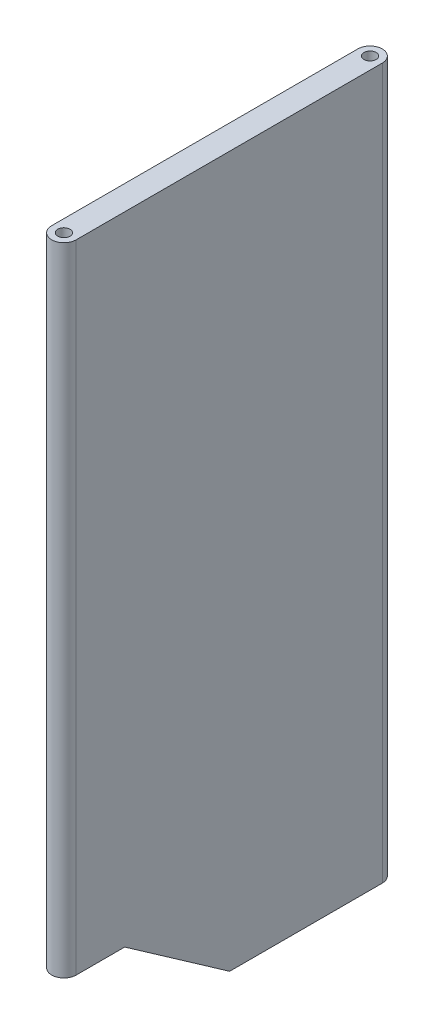
ISO-10303-21;
HEADER;
FILE_DESCRIPTION(('STEP AP214'),'2;1');
FILE_NAME('part.step','',(''),(''),'','','');
FILE_SCHEMA(('AUTOMOTIVE_DESIGN { 1 0 10303 214 1 1 1 1 }'));
ENDSEC;
DATA;
#1=APPLICATION_CONTEXT('core data for automotive mechanical design processes');
#2=APPLICATION_PROTOCOL_DEFINITION('international standard','automotive_design',2000,#1);
#3=PRODUCT_CONTEXT('',#1,'mechanical');
#4=PRODUCT('Part','Part','',(#3));
#5=PRODUCT_RELATED_PRODUCT_CATEGORY('part','',(#4));
#6=PRODUCT_DEFINITION_FORMATION('','',#4);
#7=PRODUCT_DEFINITION_CONTEXT('part definition',#1,'design');
#8=PRODUCT_DEFINITION('design','',#6,#7);
#9=PRODUCT_DEFINITION_SHAPE('','',#8);
#10=(LENGTH_UNIT() NAMED_UNIT(*) SI_UNIT(.MILLI.,.METRE.));
#11=(NAMED_UNIT(*) PLANE_ANGLE_UNIT() SI_UNIT($,.RADIAN.));
#12=(NAMED_UNIT(*) SI_UNIT($,.STERADIAN.) SOLID_ANGLE_UNIT());
#13=UNCERTAINTY_MEASURE_WITH_UNIT(LENGTH_MEASURE(1.E-05),#10,'distance_accuracy_value','');
#14=(GEOMETRIC_REPRESENTATION_CONTEXT(3) GLOBAL_UNCERTAINTY_ASSIGNED_CONTEXT((#13)) GLOBAL_UNIT_ASSIGNED_CONTEXT((#10,
#11,#12)) REPRESENTATION_CONTEXT('',''));
#15=CARTESIAN_POINT('',(0.,0.,0.));
#16=DIRECTION('',(0.,0.,1.));
#17=DIRECTION('',(1.,0.,0.));
#18=AXIS2_PLACEMENT_3D('',#15,#16,#17);
#19=CARTESIAN_POINT('',(2.,6.00000000000002,23.));
#20=DIRECTION('',(0.,1.,0.));
#21=DIRECTION('',(0.,0.,1.));
#22=AXIS2_PLACEMENT_3D('',#19,#20,#21);
#23=PLANE('',#22);
#24=DIRECTION('',(0.,0.,-1.));
#25=VECTOR('',#24,1.);
#26=CARTESIAN_POINT('',(0.,6.00000000000002,23.));
#27=LINE('',#26,#25);
#28=CARTESIAN_POINT('',(0.,6.00000000000002,24.));
#29=VERTEX_POINT('',#28);
#30=CARTESIAN_POINT('',(0.,6.00000000000002,20.0349724261597));
#31=VERTEX_POINT('',#30);
#32=EDGE_CURVE('E61',#29,#31,#27,.T.);
#33=ORIENTED_EDGE('',*,*,#32,.T.);
#34=DIRECTION('',(-1.,0.,0.));
#35=VECTOR('',#34,1.);
#36=CARTESIAN_POINT('',(2.,6.00000000000002,20.0349724261597));
#37=LINE('',#36,#35);
#38=CARTESIAN_POINT('',(2.,6.00000000000002,20.0349724261597));
#39=VERTEX_POINT('',#38);
#40=EDGE_CURVE('E11',#39,#31,#37,.T.);
#41=ORIENTED_EDGE('',*,*,#40,.F.);
#42=DIRECTION('',(0.,0.,-1.));
#43=VECTOR('',#42,1.);
#44=CARTESIAN_POINT('',(2.,6.00000000000002,23.));
#45=LINE('',#44,#43);
#46=CARTESIAN_POINT('',(2.,6.00000000000002,24.));
#47=VERTEX_POINT('',#46);
#48=EDGE_CURVE('E112',#47,#39,#45,.T.);
#49=ORIENTED_EDGE('',*,*,#48,.F.);
#50=CARTESIAN_POINT('',(1.,6.00000000000002,24.));
#51=DIRECTION('',(0.,-1.,0.));
#52=DIRECTION('',(0.,0.,1.));
#53=AXIS2_PLACEMENT_3D('',#50,#51,#52);
#54=CIRCLE('',#53,1.);
#55=EDGE_CURVE('E141',#47,#29,#54,.T.);
#56=ORIENTED_EDGE('',*,*,#55,.T.);
#57=EDGE_LOOP('',(#33,#41,#49,#56));
#58=FACE_BOUND('',#57,.T.);
#59=CARTESIAN_POINT('',(1.,6.00000000000002,24.));
#60=DIRECTION('',(0.,-1.,0.));
#61=DIRECTION('',(0.,0.,-1.));
#62=AXIS2_PLACEMENT_3D('',#59,#60,#61);
#63=CIRCLE('',#62,0.5);
#64=CARTESIAN_POINT('',(1.,6.00000000000002,23.5));
#65=VERTEX_POINT('',#64);
#66=EDGE_CURVE('E142',#65,#65,#63,.T.);
#67=ORIENTED_EDGE('',*,*,#66,.F.);
#68=EDGE_LOOP('',(#67));
#69=FACE_BOUND('',#68,.T.);
#70=ADVANCED_FACE('F34',(#58,#69),#23,.F.);
#71=CARTESIAN_POINT('',(2.,0.,11.4660843857069));
#72=DIRECTION('',(0.,0.819152044288995,-0.573576436351041));
#73=DIRECTION('',(0.,0.573576436351041,0.819152044288995));
#74=AXIS2_PLACEMENT_3D('',#71,#72,#73);
#75=PLANE('',#74);
#76=DIRECTION('',(0.,-0.573576436351041,-0.819152044288995));
#77=VECTOR('',#76,1.);
#78=CARTESIAN_POINT('',(0.,0.,11.4660843857069));
#79=LINE('',#78,#77);
#80=CARTESIAN_POINT('',(0.,0.,11.4660843857069));
#81=VERTEX_POINT('',#80);
#82=EDGE_CURVE('E118',#31,#81,#79,.T.);
#83=ORIENTED_EDGE('',*,*,#82,.T.);
#84=DIRECTION('',(-1.,0.,0.));
#85=VECTOR('',#84,1.);
#86=CARTESIAN_POINT('',(2.,0.,11.4660843857069));
#87=LINE('',#86,#85);
#88=CARTESIAN_POINT('',(2.,0.,11.4660843857069));
#89=VERTEX_POINT('',#88);
#90=EDGE_CURVE('E42',#89,#81,#87,.T.);
#91=ORIENTED_EDGE('',*,*,#90,.F.);
#92=DIRECTION('',(0.,-0.573576436351041,-0.819152044288995));
#93=VECTOR('',#92,1.);
#94=CARTESIAN_POINT('',(2.,0.,11.4660843857069));
#95=LINE('',#94,#93);
#96=EDGE_CURVE('E50',#39,#89,#95,.T.);
#97=ORIENTED_EDGE('',*,*,#96,.F.);
#98=ORIENTED_EDGE('',*,*,#40,.T.);
#99=EDGE_LOOP('',(#83,#91,#97,#98));
#100=FACE_BOUND('',#99,.T.);
#101=ADVANCED_FACE('F170',(#100),#75,.F.);
#102=CARTESIAN_POINT('',(2.,0.,11.4660843857069));
#103=DIRECTION('',(0.,1.,0.));
#104=DIRECTION('',(0.,0.,1.));
#105=AXIS2_PLACEMENT_3D('',#102,#103,#104);
#106=PLANE('',#105);
#107=DIRECTION('',(0.,0.,-1.));
#108=VECTOR('',#107,1.);
#109=CARTESIAN_POINT('',(0.,0.,11.4660843857069));
#110=LINE('',#109,#108);
#111=CARTESIAN_POINT('',(0.,0.,-1.));
#112=VERTEX_POINT('',#111);
#113=EDGE_CURVE('E101',#81,#112,#110,.T.);
#114=ORIENTED_EDGE('',*,*,#113,.T.);
#115=CARTESIAN_POINT('',(1.,0.,-1.));
#116=DIRECTION('',(0.,1.,0.));
#117=DIRECTION('',(0.,0.,-1.));
#118=AXIS2_PLACEMENT_3D('',#115,#116,#117);
#119=CIRCLE('',#118,1.);
#120=CARTESIAN_POINT('',(2.,0.,-1.));
#121=VERTEX_POINT('',#120);
#122=EDGE_CURVE('E94',#121,#112,#119,.T.);
#123=ORIENTED_EDGE('',*,*,#122,.F.);
#124=DIRECTION('',(0.,0.,-1.));
#125=VECTOR('',#124,1.);
#126=CARTESIAN_POINT('',(2.,0.,11.4660843857069));
#127=LINE('',#126,#125);
#128=EDGE_CURVE('E81',#89,#121,#127,.T.);
#129=ORIENTED_EDGE('',*,*,#128,.F.);
#130=ORIENTED_EDGE('',*,*,#90,.T.);
#131=EDGE_LOOP('',(#114,#123,#129,#130));
#132=FACE_BOUND('',#131,.T.);
#133=CARTESIAN_POINT('',(1.,0.,-1.));
#134=DIRECTION('',(0.,1.,0.));
#135=DIRECTION('',(0.,0.,1.));
#136=AXIS2_PLACEMENT_3D('',#133,#134,#135);
#137=CIRCLE('',#136,0.5);
#138=CARTESIAN_POINT('',(1.,0.,-0.5));
#139=VERTEX_POINT('',#138);
#140=EDGE_CURVE('E107',#139,#139,#137,.T.);
#141=ORIENTED_EDGE('',*,*,#140,.T.);
#142=EDGE_LOOP('',(#141));
#143=FACE_BOUND('',#142,.T.);
#144=ADVANCED_FACE('F98',(#132,#143),#106,.F.);
#145=CARTESIAN_POINT('',(2.,58.,0.));
#146=DIRECTION('',(0.,-1.,0.));
#147=DIRECTION('',(0.,0.,-1.));
#148=AXIS2_PLACEMENT_3D('',#145,#146,#147);
#149=PLANE('',#148);
#150=DIRECTION('',(0.,0.,1.));
#151=VECTOR('',#150,1.);
#152=CARTESIAN_POINT('',(0.,58.,0.));
#153=LINE('',#152,#151);
#154=CARTESIAN_POINT('',(0.,58.,-1.));
#155=VERTEX_POINT('',#154);
#156=CARTESIAN_POINT('',(0.,58.,24.));
#157=VERTEX_POINT('',#156);
#158=EDGE_CURVE('E114',#155,#157,#153,.T.);
#159=ORIENTED_EDGE('',*,*,#158,.T.);
#160=CARTESIAN_POINT('',(1.,58.,24.));
#161=DIRECTION('',(0.,-1.,0.));
#162=DIRECTION('',(0.,0.,1.));
#163=AXIS2_PLACEMENT_3D('',#160,#161,#162);
#164=CIRCLE('',#163,1.);
#165=CARTESIAN_POINT('',(2.,58.,24.));
#166=VERTEX_POINT('',#165);
#167=EDGE_CURVE('E144',#166,#157,#164,.T.);
#168=ORIENTED_EDGE('',*,*,#167,.F.);
#169=DIRECTION('',(0.,0.,1.));
#170=VECTOR('',#169,1.);
#171=CARTESIAN_POINT('',(2.,58.,0.));
#172=LINE('',#171,#170);
#173=CARTESIAN_POINT('',(2.,58.,-1.));
#174=VERTEX_POINT('',#173);
#175=EDGE_CURVE('E70',#174,#166,#172,.T.);
#176=ORIENTED_EDGE('',*,*,#175,.F.);
#177=CARTESIAN_POINT('',(1.,58.,-1.));
#178=DIRECTION('',(0.,1.,0.));
#179=DIRECTION('',(0.,0.,-1.));
#180=AXIS2_PLACEMENT_3D('',#177,#178,#179);
#181=CIRCLE('',#180,1.);
#182=EDGE_CURVE('E95',#174,#155,#181,.T.);
#183=ORIENTED_EDGE('',*,*,#182,.T.);
#184=EDGE_LOOP('',(#159,#168,#176,#183));
#185=FACE_BOUND('',#184,.T.);
#186=CARTESIAN_POINT('',(1.,58.,-1.));
#187=DIRECTION('',(0.,1.,0.));
#188=DIRECTION('',(0.,0.,1.));
#189=AXIS2_PLACEMENT_3D('',#186,#187,#188);
#190=CIRCLE('',#189,0.5);
#191=CARTESIAN_POINT('',(1.,58.,-0.5));
#192=VERTEX_POINT('',#191);
#193=EDGE_CURVE('E103',#192,#192,#190,.T.);
#194=ORIENTED_EDGE('',*,*,#193,.F.);
#195=EDGE_LOOP('',(#194));
#196=FACE_BOUND('',#195,.T.);
#197=CARTESIAN_POINT('',(1.,58.,24.));
#198=DIRECTION('',(0.,-1.,0.));
#199=DIRECTION('',(0.,0.,-1.));
#200=AXIS2_PLACEMENT_3D('',#197,#198,#199);
#201=CIRCLE('',#200,0.5);
#202=CARTESIAN_POINT('',(1.,58.,23.5));
#203=VERTEX_POINT('',#202);
#204=EDGE_CURVE('E139',#203,#203,#201,.T.);
#205=ORIENTED_EDGE('',*,*,#204,.T.);
#206=EDGE_LOOP('',(#205));
#207=FACE_BOUND('',#206,.T.);
#208=ADVANCED_FACE('F131',(#185,#196,#207),#149,.F.);
#209=CARTESIAN_POINT('',(2.,0.,0.));
#210=DIRECTION('',(1.,0.,0.));
#211=DIRECTION('',(0.,0.,-1.));
#212=AXIS2_PLACEMENT_3D('',#209,#210,#211);
#213=PLANE('',#212);
#214=ORIENTED_EDGE('',*,*,#175,.T.);
#215=DIRECTION('',(0.,-1.,0.));
#216=VECTOR('',#215,1.);
#217=CARTESIAN_POINT('',(2.,58.,24.));
#218=LINE('',#217,#216);
#219=EDGE_CURVE('E150',#166,#47,#218,.T.);
#220=ORIENTED_EDGE('',*,*,#219,.T.);
#221=ORIENTED_EDGE('',*,*,#48,.T.);
#222=ORIENTED_EDGE('',*,*,#96,.T.);
#223=ORIENTED_EDGE('',*,*,#128,.T.);
#224=DIRECTION('',(0.,-1.,0.));
#225=VECTOR('',#224,1.);
#226=CARTESIAN_POINT('',(2.,58.,-1.));
#227=LINE('',#226,#225);
#228=EDGE_CURVE('E84',#174,#121,#227,.T.);
#229=ORIENTED_EDGE('',*,*,#228,.F.);
#230=EDGE_LOOP('',(#214,#220,#221,#222,#223,#229));
#231=FACE_BOUND('',#230,.T.);
#232=ADVANCED_FACE('F83',(#231),#213,.T.);
#233=CARTESIAN_POINT('',(0.,0.,0.));
#234=DIRECTION('',(1.,0.,0.));
#235=DIRECTION('',(0.,0.,-1.));
#236=AXIS2_PLACEMENT_3D('',#233,#234,#235);
#237=PLANE('',#236);
#238=ORIENTED_EDGE('',*,*,#32,.F.);
#239=DIRECTION('',(0.,-1.,0.));
#240=VECTOR('',#239,1.);
#241=CARTESIAN_POINT('',(0.,58.,24.));
#242=LINE('',#241,#240);
#243=EDGE_CURVE('E129',#157,#29,#242,.T.);
#244=ORIENTED_EDGE('',*,*,#243,.F.);
#245=ORIENTED_EDGE('',*,*,#158,.F.);
#246=DIRECTION('',(0.,-1.,0.));
#247=VECTOR('',#246,1.);
#248=CARTESIAN_POINT('',(0.,58.,-1.));
#249=LINE('',#248,#247);
#250=EDGE_CURVE('E96',#155,#112,#249,.T.);
#251=ORIENTED_EDGE('',*,*,#250,.T.);
#252=ORIENTED_EDGE('',*,*,#113,.F.);
#253=ORIENTED_EDGE('',*,*,#82,.F.);
#254=EDGE_LOOP('',(#238,#244,#245,#251,#252,#253));
#255=FACE_BOUND('',#254,.T.);
#256=ADVANCED_FACE('F125',(#255),#237,.F.);
#257=CARTESIAN_POINT('',(1.,58.,-1.));
#258=DIRECTION('',(0.,-1.,0.));
#259=DIRECTION('',(0.,0.,-1.));
#260=AXIS2_PLACEMENT_3D('',#257,#258,#259);
#261=CYLINDRICAL_SURFACE('',#260,1.);
#262=ORIENTED_EDGE('',*,*,#122,.T.);
#263=ORIENTED_EDGE('',*,*,#250,.F.);
#264=ORIENTED_EDGE('',*,*,#182,.F.);
#265=ORIENTED_EDGE('',*,*,#228,.T.);
#266=EDGE_LOOP('',(#262,#263,#264,#265));
#267=FACE_BOUND('',#266,.T.);
#268=ADVANCED_FACE('F92',(#267),#261,.T.);
#269=CARTESIAN_POINT('',(1.,58.,-1.));
#270=DIRECTION('',(0.,-1.,0.));
#271=DIRECTION('',(0.,0.,-1.));
#272=AXIS2_PLACEMENT_3D('',#269,#270,#271);
#273=CYLINDRICAL_SURFACE('',#272,0.5);
#274=ORIENTED_EDGE('',*,*,#193,.T.);
#275=EDGE_LOOP('',(#274));
#276=FACE_BOUND('',#275,.T.);
#277=ORIENTED_EDGE('',*,*,#140,.F.);
#278=EDGE_LOOP('',(#277));
#279=FACE_BOUND('',#278,.T.);
#280=ADVANCED_FACE('F156',(#276,#279),#273,.F.);
#281=CARTESIAN_POINT('',(1.,58.,24.));
#282=DIRECTION('',(0.,-1.,0.));
#283=DIRECTION('',(0.,0.,-1.));
#284=AXIS2_PLACEMENT_3D('',#281,#282,#283);
#285=CYLINDRICAL_SURFACE('',#284,1.);
#286=ORIENTED_EDGE('',*,*,#55,.F.);
#287=ORIENTED_EDGE('',*,*,#219,.F.);
#288=ORIENTED_EDGE('',*,*,#167,.T.);
#289=ORIENTED_EDGE('',*,*,#243,.T.);
#290=EDGE_LOOP('',(#286,#287,#288,#289));
#291=FACE_BOUND('',#290,.T.);
#292=ADVANCED_FACE('F158',(#291),#285,.T.);
#293=CARTESIAN_POINT('',(1.,58.,24.));
#294=DIRECTION('',(0.,-1.,0.));
#295=DIRECTION('',(0.,0.,-1.));
#296=AXIS2_PLACEMENT_3D('',#293,#294,#295);
#297=CYLINDRICAL_SURFACE('',#296,0.5);
#298=ORIENTED_EDGE('',*,*,#204,.F.);
#299=EDGE_LOOP('',(#298));
#300=FACE_BOUND('',#299,.T.);
#301=ORIENTED_EDGE('',*,*,#66,.T.);
#302=EDGE_LOOP('',(#301));
#303=FACE_BOUND('',#302,.T.);
#304=ADVANCED_FACE('F165',(#300,#303),#297,.F.);
#305=CLOSED_SHELL('',(#70,#101,#144,#208,#232,#256,#268,#280,#292,#304));
#306=MANIFOLD_SOLID_BREP('B2',#305);
#307=ADVANCED_BREP_SHAPE_REPRESENTATION('',(#18,#306),#14);
#308=SHAPE_DEFINITION_REPRESENTATION(#9,#307);
ENDSEC;
END-ISO-10303-21;
